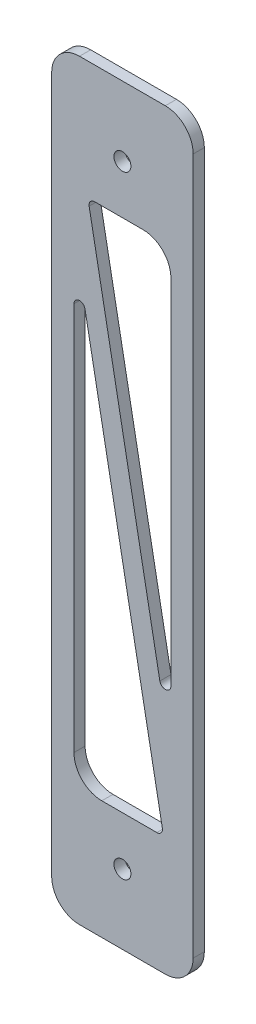
ISO-10303-21;
HEADER;
FILE_DESCRIPTION(('STEP AP214'),'2;1');
FILE_NAME('part.step','',(''),(''),'','','');
FILE_SCHEMA(('AUTOMOTIVE_DESIGN { 1 0 10303 214 1 1 1 1 }'));
ENDSEC;
DATA;
#1=APPLICATION_CONTEXT('core data for automotive mechanical design processes');
#2=APPLICATION_PROTOCOL_DEFINITION('international standard','automotive_design',2000,#1);
#3=PRODUCT_CONTEXT('',#1,'mechanical');
#4=PRODUCT('Part','Part','',(#3));
#5=PRODUCT_RELATED_PRODUCT_CATEGORY('part','',(#4));
#6=PRODUCT_DEFINITION_FORMATION('','',#4);
#7=PRODUCT_DEFINITION_CONTEXT('part definition',#1,'design');
#8=PRODUCT_DEFINITION('design','',#6,#7);
#9=PRODUCT_DEFINITION_SHAPE('','',#8);
#10=(LENGTH_UNIT() NAMED_UNIT(*) SI_UNIT(.MILLI.,.METRE.));
#11=(NAMED_UNIT(*) PLANE_ANGLE_UNIT() SI_UNIT($,.RADIAN.));
#12=(NAMED_UNIT(*) SI_UNIT($,.STERADIAN.) SOLID_ANGLE_UNIT());
#13=UNCERTAINTY_MEASURE_WITH_UNIT(LENGTH_MEASURE(1.E-05),#10,'distance_accuracy_value','');
#14=(GEOMETRIC_REPRESENTATION_CONTEXT(3) GLOBAL_UNCERTAINTY_ASSIGNED_CONTEXT((#13)) GLOBAL_UNIT_ASSIGNED_CONTEXT((#10,
#11,#12)) REPRESENTATION_CONTEXT('',''));
#15=CARTESIAN_POINT('',(0.,0.,0.));
#16=DIRECTION('',(0.,0.,1.));
#17=DIRECTION('',(1.,0.,0.));
#18=AXIS2_PLACEMENT_3D('',#15,#16,#17);
#19=CARTESIAN_POINT('',(15.4,-125.,4.));
#20=DIRECTION('',(0.,0.,1.));
#21=DIRECTION('',(1.,0.,0.));
#22=AXIS2_PLACEMENT_3D('',#19,#20,#21);
#23=PLANE('',#22);
#24=CARTESIAN_POINT('',(0.,110.,4.));
#25=DIRECTION('',(0.,0.,1.));
#26=DIRECTION('',(1.,0.,0.));
#27=AXIS2_PLACEMENT_3D('',#24,#25,#26);
#28=CIRCLE('',#27,3.05);
#29=CARTESIAN_POINT('',(3.04999999999996,110.,4.));
#30=VERTEX_POINT('',#29);
#31=EDGE_CURVE('E278',#30,#30,#28,.T.);
#32=ORIENTED_EDGE('',*,*,#31,.F.);
#33=EDGE_LOOP('',(#32));
#34=FACE_BOUND('',#33,.T.);
#35=CARTESIAN_POINT('',(15.4,-125.,4.));
#36=DIRECTION('',(0.,0.,1.));
#37=DIRECTION('',(1.,0.,0.));
#38=AXIS2_PLACEMENT_3D('',#35,#36,#37);
#39=CIRCLE('',#38,10.);
#40=CARTESIAN_POINT('',(15.3999999999999,-135.,4.));
#41=VERTEX_POINT('',#40);
#42=CARTESIAN_POINT('',(25.4,-125.,4.));
#43=VERTEX_POINT('',#42);
#44=EDGE_CURVE('E284',#41,#43,#39,.T.);
#45=ORIENTED_EDGE('',*,*,#44,.T.);
#46=DIRECTION('',(0.,1.,0.));
#47=VECTOR('',#46,1.);
#48=CARTESIAN_POINT('',(25.4,-125.,4.));
#49=LINE('',#48,#47);
#50=CARTESIAN_POINT('',(25.4,125.,4.));
#51=VERTEX_POINT('',#50);
#52=EDGE_CURVE('E287',#43,#51,#49,.T.);
#53=ORIENTED_EDGE('',*,*,#52,.T.);
#54=CARTESIAN_POINT('',(15.4,125.,4.));
#55=DIRECTION('',(0.,0.,1.));
#56=DIRECTION('',(1.,0.,0.));
#57=AXIS2_PLACEMENT_3D('',#54,#55,#56);
#58=CIRCLE('',#57,10.);
#59=CARTESIAN_POINT('',(15.3999999999999,135.,4.));
#60=VERTEX_POINT('',#59);
#61=EDGE_CURVE('E290',#51,#60,#58,.T.);
#62=ORIENTED_EDGE('',*,*,#61,.T.);
#63=DIRECTION('',(-1.,0.,0.));
#64=VECTOR('',#63,1.);
#65=CARTESIAN_POINT('',(15.3999999999999,135.,4.));
#66=LINE('',#65,#64);
#67=CARTESIAN_POINT('',(-15.3999999999999,135.,4.));
#68=VERTEX_POINT('',#67);
#69=EDGE_CURVE('E292',#60,#68,#66,.T.);
#70=ORIENTED_EDGE('',*,*,#69,.T.);
#71=CARTESIAN_POINT('',(-15.4,125.,4.));
#72=DIRECTION('',(0.,0.,1.));
#73=DIRECTION('',(1.,0.,0.));
#74=AXIS2_PLACEMENT_3D('',#71,#72,#73);
#75=CIRCLE('',#74,10.);
#76=CARTESIAN_POINT('',(-25.4,125.,4.));
#77=VERTEX_POINT('',#76);
#78=EDGE_CURVE('E294',#68,#77,#75,.T.);
#79=ORIENTED_EDGE('',*,*,#78,.T.);
#80=DIRECTION('',(0.,-1.,0.));
#81=VECTOR('',#80,1.);
#82=CARTESIAN_POINT('',(-25.4,-125.,4.));
#83=LINE('',#82,#81);
#84=CARTESIAN_POINT('',(-25.4,-125.,4.));
#85=VERTEX_POINT('',#84);
#86=EDGE_CURVE('E296',#77,#85,#83,.T.);
#87=ORIENTED_EDGE('',*,*,#86,.T.);
#88=CARTESIAN_POINT('',(-15.4,-125.,4.));
#89=DIRECTION('',(0.,0.,1.));
#90=DIRECTION('',(-1.,0.,0.));
#91=AXIS2_PLACEMENT_3D('',#88,#89,#90);
#92=CIRCLE('',#91,10.);
#93=CARTESIAN_POINT('',(-15.3999999999999,-135.,4.));
#94=VERTEX_POINT('',#93);
#95=EDGE_CURVE('E298',#85,#94,#92,.T.);
#96=ORIENTED_EDGE('',*,*,#95,.T.);
#97=DIRECTION('',(1.,0.,0.));
#98=VECTOR('',#97,1.);
#99=CARTESIAN_POINT('',(15.3999999999999,-135.,4.));
#100=LINE('',#99,#98);
#101=EDGE_CURVE('E300',#94,#41,#100,.T.);
#102=ORIENTED_EDGE('',*,*,#101,.T.);
#103=EDGE_LOOP('',(#45,#53,#62,#70,#79,#87,#96,#102));
#104=FACE_BOUND('',#103,.T.);
#105=CARTESIAN_POINT('',(0.,-110.,4.));
#106=DIRECTION('',(0.,0.,1.));
#107=DIRECTION('',(1.,0.,0.));
#108=AXIS2_PLACEMENT_3D('',#105,#106,#107);
#109=CIRCLE('',#108,3.05);
#110=CARTESIAN_POINT('',(3.05000000000003,-110.,4.));
#111=VERTEX_POINT('',#110);
#112=EDGE_CURVE('E272',#111,#111,#109,.T.);
#113=ORIENTED_EDGE('',*,*,#112,.F.);
#114=EDGE_LOOP('',(#113));
#115=FACE_BOUND('',#114,.T.);
#116=DIRECTION('',(1.,0.,0.));
#117=VECTOR('',#116,1.);
#118=CARTESIAN_POINT('',(12.3570173407324,-92.4803149606299,4.));
#119=LINE('',#118,#117);
#120=CARTESIAN_POINT('',(-7.39999999999993,-92.4803149606299,4.));
#121=VERTEX_POINT('',#120);
#122=CARTESIAN_POINT('',(12.3570173407324,-92.4803149606299,4.));
#123=VERTEX_POINT('',#122);
#124=EDGE_CURVE('E229',#121,#123,#119,.T.);
#125=ORIENTED_EDGE('',*,*,#124,.F.);
#126=CARTESIAN_POINT('',(-7.4,-82.4803149606299,4.));
#127=DIRECTION('',(0.,0.,1.));
#128=DIRECTION('',(-1.,0.,0.));
#129=AXIS2_PLACEMENT_3D('',#126,#127,#128);
#130=CIRCLE('',#129,10.);
#131=CARTESIAN_POINT('',(-17.4,-82.4803149606298,4.));
#132=VERTEX_POINT('',#131);
#133=EDGE_CURVE('E227',#132,#121,#130,.T.);
#134=ORIENTED_EDGE('',*,*,#133,.F.);
#135=DIRECTION('',(0.,-1.,0.));
#136=VECTOR('',#135,1.);
#137=CARTESIAN_POINT('',(-17.4,-82.4803149606298,4.));
#138=LINE('',#137,#136);
#139=CARTESIAN_POINT('',(-17.4,57.0471394094039,4.));
#140=VERTEX_POINT('',#139);
#141=EDGE_CURVE('E239',#140,#132,#138,.T.);
#142=ORIENTED_EDGE('',*,*,#141,.F.);
#143=CARTESIAN_POINT('',(-15.4,57.0471394094047,4.));
#144=DIRECTION('',(0.,0.,1.));
#145=DIRECTION('',(-1.,0.,0.));
#146=AXIS2_PLACEMENT_3D('',#143,#144,#145);
#147=CIRCLE('',#146,2.);
#148=CARTESIAN_POINT('',(-13.4344867634496,57.4169470850215,4.));
#149=VERTEX_POINT('',#148);
#150=EDGE_CURVE('E236',#149,#140,#147,.T.);
#151=ORIENTED_EDGE('',*,*,#150,.F.);
#152=DIRECTION('',(-0.184903837808803,0.982756618275133,0.));
#153=VECTOR('',#152,1.);
#154=CARTESIAN_POINT('',(-13.4344867634496,57.4169470850215,4.));
#155=LINE('',#154,#153);
#156=CARTESIAN_POINT('',(14.3225305772827,-90.1105072850123,4.));
#157=VERTEX_POINT('',#156);
#158=EDGE_CURVE('E234',#157,#149,#155,.T.);
#159=ORIENTED_EDGE('',*,*,#158,.F.);
#160=CARTESIAN_POINT('',(12.3570173407325,-90.4803149606299,4.));
#161=DIRECTION('',(0.,0.,1.));
#162=DIRECTION('',(1.,0.,0.));
#163=AXIS2_PLACEMENT_3D('',#160,#161,#162);
#164=CIRCLE('',#163,2.);
#165=EDGE_CURVE('E232',#123,#157,#164,.T.);
#166=ORIENTED_EDGE('',*,*,#165,.F.);
#167=EDGE_LOOP('',(#125,#134,#142,#151,#159,#166));
#168=FACE_BOUND('',#167,.T.);
#169=DIRECTION('',(-1.,0.,0.));
#170=VECTOR('',#169,1.);
#171=CARTESIAN_POINT('',(7.39999999999992,92.4803149606299,4.));
#172=LINE('',#171,#170);
#173=CARTESIAN_POINT('',(7.39999999999992,92.4803149606299,4.));
#174=VERTEX_POINT('',#173);
#175=CARTESIAN_POINT('',(-9.98861183781499,92.4803149606299,4.));
#176=VERTEX_POINT('',#175);
#177=EDGE_CURVE('E184',#174,#176,#172,.T.);
#178=ORIENTED_EDGE('',*,*,#177,.F.);
#179=CARTESIAN_POINT('',(7.4,82.4803149606299,4.));
#180=DIRECTION('',(0.,0.,1.));
#181=DIRECTION('',(1.,0.,0.));
#182=AXIS2_PLACEMENT_3D('',#179,#180,#181);
#183=CIRCLE('',#182,10.);
#184=CARTESIAN_POINT('',(17.4,82.4803149606299,4.));
#185=VERTEX_POINT('',#184);
#186=EDGE_CURVE('E176',#185,#174,#183,.T.);
#187=ORIENTED_EDGE('',*,*,#186,.F.);
#188=DIRECTION('',(0.,1.,0.));
#189=VECTOR('',#188,1.);
#190=CARTESIAN_POINT('',(17.4,-44.4591574057088,4.));
#191=LINE('',#190,#189);
#192=CARTESIAN_POINT('',(17.4,-44.4591574057088,4.));
#193=VERTEX_POINT('',#192);
#194=EDGE_CURVE('E205',#193,#185,#191,.T.);
#195=ORIENTED_EDGE('',*,*,#194,.F.);
#196=CARTESIAN_POINT('',(15.4,-44.4591574057096,4.));
#197=DIRECTION('',(0.,0.,1.));
#198=DIRECTION('',(-1.,0.,0.));
#199=AXIS2_PLACEMENT_3D('',#196,#197,#198);
#200=CIRCLE('',#199,2.);
#201=CARTESIAN_POINT('',(13.4344867634496,-44.8289650813264,4.));
#202=VERTEX_POINT('',#201);
#203=EDGE_CURVE('E203',#202,#193,#200,.T.);
#204=ORIENTED_EDGE('',*,*,#203,.F.);
#205=DIRECTION('',(0.184903837808803,-0.982756618275133,0.));
#206=VECTOR('',#205,1.);
#207=CARTESIAN_POINT('',(-11.9541250743653,90.1105072850123,4.));
#208=LINE('',#207,#206);
#209=CARTESIAN_POINT('',(-11.9541250743653,90.1105072850123,4.));
#210=VERTEX_POINT('',#209);
#211=EDGE_CURVE('E199',#210,#202,#208,.T.);
#212=ORIENTED_EDGE('',*,*,#211,.F.);
#213=CARTESIAN_POINT('',(-9.98861183781501,90.4803149606299,4.));
#214=DIRECTION('',(0.,0.,1.));
#215=DIRECTION('',(1.,0.,0.));
#216=AXIS2_PLACEMENT_3D('',#213,#214,#215);
#217=CIRCLE('',#216,2.);
#218=EDGE_CURVE('E197',#176,#210,#217,.T.);
#219=ORIENTED_EDGE('',*,*,#218,.F.);
#220=EDGE_LOOP('',(#178,#187,#195,#204,#212,#219));
#221=FACE_BOUND('',#220,.T.);
#222=ADVANCED_FACE('F39',(#34,#104,#115,#168,#221),#23,.T.);
#223=CARTESIAN_POINT('',(15.4,-125.,0.));
#224=DIRECTION('',(0.,0.,1.));
#225=DIRECTION('',(1.,0.,0.));
#226=AXIS2_PLACEMENT_3D('',#223,#224,#225);
#227=PLANE('',#226);
#228=CARTESIAN_POINT('',(-7.4,-82.4803149606299,0.));
#229=DIRECTION('',(0.,0.,1.));
#230=DIRECTION('',(-1.,0.,0.));
#231=AXIS2_PLACEMENT_3D('',#228,#229,#230);
#232=CIRCLE('',#231,10.);
#233=CARTESIAN_POINT('',(-17.4,-82.4803149606298,0.));
#234=VERTEX_POINT('',#233);
#235=CARTESIAN_POINT('',(-7.39999999999993,-92.4803149606299,0.));
#236=VERTEX_POINT('',#235);
#237=EDGE_CURVE('E192',#234,#236,#232,.T.);
#238=ORIENTED_EDGE('',*,*,#237,.T.);
#239=DIRECTION('',(1.,0.,0.));
#240=VECTOR('',#239,1.);
#241=CARTESIAN_POINT('',(12.3570173407324,-92.4803149606299,0.));
#242=LINE('',#241,#240);
#243=CARTESIAN_POINT('',(12.3570173407324,-92.4803149606299,0.));
#244=VERTEX_POINT('',#243);
#245=EDGE_CURVE('E244',#236,#244,#242,.T.);
#246=ORIENTED_EDGE('',*,*,#245,.T.);
#247=CARTESIAN_POINT('',(12.3570173407325,-90.4803149606299,0.));
#248=DIRECTION('',(0.,0.,1.));
#249=DIRECTION('',(1.,0.,0.));
#250=AXIS2_PLACEMENT_3D('',#247,#248,#249);
#251=CIRCLE('',#250,2.);
#252=CARTESIAN_POINT('',(14.3225305772827,-90.1105072850123,0.));
#253=VERTEX_POINT('',#252);
#254=EDGE_CURVE('E247',#244,#253,#251,.T.);
#255=ORIENTED_EDGE('',*,*,#254,.T.);
#256=DIRECTION('',(-0.184903837808803,0.982756618275133,0.));
#257=VECTOR('',#256,1.);
#258=CARTESIAN_POINT('',(-13.4344867634496,57.4169470850215,0.));
#259=LINE('',#258,#257);
#260=CARTESIAN_POINT('',(-13.4344867634496,57.4169470850215,0.));
#261=VERTEX_POINT('',#260);
#262=EDGE_CURVE('E250',#253,#261,#259,.T.);
#263=ORIENTED_EDGE('',*,*,#262,.T.);
#264=CARTESIAN_POINT('',(-15.4,57.0471394094047,0.));
#265=DIRECTION('',(0.,0.,1.));
#266=DIRECTION('',(-1.,0.,0.));
#267=AXIS2_PLACEMENT_3D('',#264,#265,#266);
#268=CIRCLE('',#267,2.);
#269=CARTESIAN_POINT('',(-17.4,57.0471394094039,0.));
#270=VERTEX_POINT('',#269);
#271=EDGE_CURVE('E253',#261,#270,#268,.T.);
#272=ORIENTED_EDGE('',*,*,#271,.T.);
#273=DIRECTION('',(0.,-1.,0.));
#274=VECTOR('',#273,1.);
#275=CARTESIAN_POINT('',(-17.4,-82.4803149606298,0.));
#276=LINE('',#275,#274);
#277=EDGE_CURVE('E230',#270,#234,#276,.T.);
#278=ORIENTED_EDGE('',*,*,#277,.T.);
#279=EDGE_LOOP('',(#238,#246,#255,#263,#272,#278));
#280=FACE_BOUND('',#279,.T.);
#281=CARTESIAN_POINT('',(15.4,-125.,0.));
#282=DIRECTION('',(0.,0.,1.));
#283=DIRECTION('',(1.,0.,0.));
#284=AXIS2_PLACEMENT_3D('',#281,#282,#283);
#285=CIRCLE('',#284,10.);
#286=CARTESIAN_POINT('',(15.3999999999999,-135.,0.));
#287=VERTEX_POINT('',#286);
#288=CARTESIAN_POINT('',(25.4,-125.,0.));
#289=VERTEX_POINT('',#288);
#290=EDGE_CURVE('E281',#287,#289,#285,.T.);
#291=ORIENTED_EDGE('',*,*,#290,.F.);
#292=DIRECTION('',(1.,0.,0.));
#293=VECTOR('',#292,1.);
#294=CARTESIAN_POINT('',(15.3999999999999,-135.,0.));
#295=LINE('',#294,#293);
#296=CARTESIAN_POINT('',(-15.3999999999999,-135.,0.));
#297=VERTEX_POINT('',#296);
#298=EDGE_CURVE('E288',#297,#287,#295,.T.);
#299=ORIENTED_EDGE('',*,*,#298,.F.);
#300=CARTESIAN_POINT('',(-15.4,-125.,0.));
#301=DIRECTION('',(0.,0.,1.));
#302=DIRECTION('',(-1.,0.,0.));
#303=AXIS2_PLACEMENT_3D('',#300,#301,#302);
#304=CIRCLE('',#303,10.);
#305=CARTESIAN_POINT('',(-25.4,-125.,0.));
#306=VERTEX_POINT('',#305);
#307=EDGE_CURVE('E315',#306,#297,#304,.T.);
#308=ORIENTED_EDGE('',*,*,#307,.F.);
#309=DIRECTION('',(0.,-1.,0.));
#310=VECTOR('',#309,1.);
#311=CARTESIAN_POINT('',(-25.4,-125.,0.));
#312=LINE('',#311,#310);
#313=CARTESIAN_POINT('',(-25.4,125.,0.));
#314=VERTEX_POINT('',#313);
#315=EDGE_CURVE('E313',#314,#306,#312,.T.);
#316=ORIENTED_EDGE('',*,*,#315,.F.);
#317=CARTESIAN_POINT('',(-15.4,125.,0.));
#318=DIRECTION('',(0.,0.,1.));
#319=DIRECTION('',(1.,0.,0.));
#320=AXIS2_PLACEMENT_3D('',#317,#318,#319);
#321=CIRCLE('',#320,10.);
#322=CARTESIAN_POINT('',(-15.3999999999999,135.,0.));
#323=VERTEX_POINT('',#322);
#324=EDGE_CURVE('E311',#323,#314,#321,.T.);
#325=ORIENTED_EDGE('',*,*,#324,.F.);
#326=DIRECTION('',(-1.,0.,0.));
#327=VECTOR('',#326,1.);
#328=CARTESIAN_POINT('',(15.3999999999999,135.,0.));
#329=LINE('',#328,#327);
#330=CARTESIAN_POINT('',(15.3999999999999,135.,0.));
#331=VERTEX_POINT('',#330);
#332=EDGE_CURVE('E309',#331,#323,#329,.T.);
#333=ORIENTED_EDGE('',*,*,#332,.F.);
#334=CARTESIAN_POINT('',(15.4,125.,0.));
#335=DIRECTION('',(0.,0.,1.));
#336=DIRECTION('',(1.,0.,0.));
#337=AXIS2_PLACEMENT_3D('',#334,#335,#336);
#338=CIRCLE('',#337,10.);
#339=CARTESIAN_POINT('',(25.4,125.,0.));
#340=VERTEX_POINT('',#339);
#341=EDGE_CURVE('E307',#340,#331,#338,.T.);
#342=ORIENTED_EDGE('',*,*,#341,.F.);
#343=DIRECTION('',(0.,1.,0.));
#344=VECTOR('',#343,1.);
#345=CARTESIAN_POINT('',(25.4,-125.,0.));
#346=LINE('',#345,#344);
#347=EDGE_CURVE('E305',#289,#340,#346,.T.);
#348=ORIENTED_EDGE('',*,*,#347,.F.);
#349=EDGE_LOOP('',(#291,#299,#308,#316,#325,#333,#342,#348));
#350=FACE_BOUND('',#349,.T.);
#351=CARTESIAN_POINT('',(0.,110.,0.));
#352=DIRECTION('',(0.,0.,1.));
#353=DIRECTION('',(1.,0.,0.));
#354=AXIS2_PLACEMENT_3D('',#351,#352,#353);
#355=CIRCLE('',#354,3.05);
#356=CARTESIAN_POINT('',(3.04999999999996,110.,0.));
#357=VERTEX_POINT('',#356);
#358=EDGE_CURVE('E275',#357,#357,#355,.T.);
#359=ORIENTED_EDGE('',*,*,#358,.T.);
#360=EDGE_LOOP('',(#359));
#361=FACE_BOUND('',#360,.T.);
#362=CARTESIAN_POINT('',(0.,-110.,0.));
#363=DIRECTION('',(0.,0.,1.));
#364=DIRECTION('',(1.,0.,0.));
#365=AXIS2_PLACEMENT_3D('',#362,#363,#364);
#366=CIRCLE('',#365,3.05);
#367=CARTESIAN_POINT('',(3.05000000000003,-110.,0.));
#368=VERTEX_POINT('',#367);
#369=EDGE_CURVE('E271',#368,#368,#366,.T.);
#370=ORIENTED_EDGE('',*,*,#369,.T.);
#371=EDGE_LOOP('',(#370));
#372=FACE_BOUND('',#371,.T.);
#373=CARTESIAN_POINT('',(7.4,82.4803149606299,0.));
#374=DIRECTION('',(0.,0.,1.));
#375=DIRECTION('',(1.,0.,0.));
#376=AXIS2_PLACEMENT_3D('',#373,#374,#375);
#377=CIRCLE('',#376,10.);
#378=CARTESIAN_POINT('',(17.4,82.4803149606299,0.));
#379=VERTEX_POINT('',#378);
#380=CARTESIAN_POINT('',(7.39999999999992,92.4803149606299,0.));
#381=VERTEX_POINT('',#380);
#382=EDGE_CURVE('E62',#379,#381,#377,.T.);
#383=ORIENTED_EDGE('',*,*,#382,.T.);
#384=DIRECTION('',(-1.,0.,0.));
#385=VECTOR('',#384,1.);
#386=CARTESIAN_POINT('',(7.39999999999992,92.4803149606299,0.));
#387=LINE('',#386,#385);
#388=CARTESIAN_POINT('',(-9.98861183781499,92.4803149606299,0.));
#389=VERTEX_POINT('',#388);
#390=EDGE_CURVE('E191',#381,#389,#387,.T.);
#391=ORIENTED_EDGE('',*,*,#390,.T.);
#392=CARTESIAN_POINT('',(-9.98861183781501,90.4803149606299,0.));
#393=DIRECTION('',(0.,0.,1.));
#394=DIRECTION('',(1.,0.,0.));
#395=AXIS2_PLACEMENT_3D('',#392,#393,#394);
#396=CIRCLE('',#395,2.);
#397=CARTESIAN_POINT('',(-11.9541250743653,90.1105072850123,0.));
#398=VERTEX_POINT('',#397);
#399=EDGE_CURVE('E209',#389,#398,#396,.T.);
#400=ORIENTED_EDGE('',*,*,#399,.T.);
#401=DIRECTION('',(0.184903837808803,-0.982756618275133,0.));
#402=VECTOR('',#401,1.);
#403=CARTESIAN_POINT('',(-11.9541250743653,90.1105072850123,0.));
#404=LINE('',#403,#402);
#405=CARTESIAN_POINT('',(13.4344867634496,-44.8289650813264,0.));
#406=VERTEX_POINT('',#405);
#407=EDGE_CURVE('E212',#398,#406,#404,.T.);
#408=ORIENTED_EDGE('',*,*,#407,.T.);
#409=CARTESIAN_POINT('',(15.4,-44.4591574057096,0.));
#410=DIRECTION('',(0.,0.,1.));
#411=DIRECTION('',(-1.,0.,0.));
#412=AXIS2_PLACEMENT_3D('',#409,#410,#411);
#413=CIRCLE('',#412,2.);
#414=CARTESIAN_POINT('',(17.4,-44.4591574057088,0.));
#415=VERTEX_POINT('',#414);
#416=EDGE_CURVE('E215',#406,#415,#413,.T.);
#417=ORIENTED_EDGE('',*,*,#416,.T.);
#418=DIRECTION('',(0.,1.,0.));
#419=VECTOR('',#418,1.);
#420=CARTESIAN_POINT('',(17.4,-44.4591574057088,0.));
#421=LINE('',#420,#419);
#422=EDGE_CURVE('E185',#415,#379,#421,.T.);
#423=ORIENTED_EDGE('',*,*,#422,.T.);
#424=EDGE_LOOP('',(#383,#391,#400,#408,#417,#423));
#425=FACE_BOUND('',#424,.T.);
#426=ADVANCED_FACE('F345',(#280,#350,#361,#372,#425),#227,.F.);
#427=CARTESIAN_POINT('',(15.4,-125.,4.));
#428=DIRECTION('',(0.,0.,-1.));
#429=DIRECTION('',(-1.,0.,0.));
#430=AXIS2_PLACEMENT_3D('',#427,#428,#429);
#431=CYLINDRICAL_SURFACE('',#430,10.);
#432=ORIENTED_EDGE('',*,*,#290,.T.);
#433=DIRECTION('',(0.,0.,-1.));
#434=VECTOR('',#433,1.);
#435=CARTESIAN_POINT('',(25.4,-125.,4.));
#436=LINE('',#435,#434);
#437=EDGE_CURVE('E11',#43,#289,#436,.T.);
#438=ORIENTED_EDGE('',*,*,#437,.F.);
#439=ORIENTED_EDGE('',*,*,#44,.F.);
#440=DIRECTION('',(0.,0.,-1.));
#441=VECTOR('',#440,1.);
#442=CARTESIAN_POINT('',(15.3999999999999,-135.,4.));
#443=LINE('',#442,#441);
#444=EDGE_CURVE('E302',#41,#287,#443,.T.);
#445=ORIENTED_EDGE('',*,*,#444,.T.);
#446=EDGE_LOOP('',(#432,#438,#439,#445));
#447=FACE_BOUND('',#446,.T.);
#448=ADVANCED_FACE('F41',(#447),#431,.T.);
#449=CARTESIAN_POINT('',(25.4,-125.,4.));
#450=DIRECTION('',(-1.,0.,0.));
#451=DIRECTION('',(0.,0.,1.));
#452=AXIS2_PLACEMENT_3D('',#449,#450,#451);
#453=PLANE('',#452);
#454=ORIENTED_EDGE('',*,*,#347,.T.);
#455=DIRECTION('',(0.,0.,-1.));
#456=VECTOR('',#455,1.);
#457=CARTESIAN_POINT('',(25.4,125.,4.));
#458=LINE('',#457,#456);
#459=EDGE_CURVE('E47',#51,#340,#458,.T.);
#460=ORIENTED_EDGE('',*,*,#459,.F.);
#461=ORIENTED_EDGE('',*,*,#52,.F.);
#462=ORIENTED_EDGE('',*,*,#437,.T.);
#463=EDGE_LOOP('',(#454,#460,#461,#462));
#464=FACE_BOUND('',#463,.T.);
#465=ADVANCED_FACE('F363',(#464),#453,.F.);
#466=CARTESIAN_POINT('',(15.4,125.,4.));
#467=DIRECTION('',(0.,0.,-1.));
#468=DIRECTION('',(-1.,0.,0.));
#469=AXIS2_PLACEMENT_3D('',#466,#467,#468);
#470=CYLINDRICAL_SURFACE('',#469,10.);
#471=ORIENTED_EDGE('',*,*,#341,.T.);
#472=DIRECTION('',(0.,0.,-1.));
#473=VECTOR('',#472,1.);
#474=CARTESIAN_POINT('',(15.3999999999999,135.,4.));
#475=LINE('',#474,#473);
#476=EDGE_CURVE('E332',#60,#331,#475,.T.);
#477=ORIENTED_EDGE('',*,*,#476,.F.);
#478=ORIENTED_EDGE('',*,*,#61,.F.);
#479=ORIENTED_EDGE('',*,*,#459,.T.);
#480=EDGE_LOOP('',(#471,#477,#478,#479));
#481=FACE_BOUND('',#480,.T.);
#482=ADVANCED_FACE('F339',(#481),#470,.T.);
#483=CARTESIAN_POINT('',(15.3999999999999,135.,4.));
#484=DIRECTION('',(0.,-1.,0.));
#485=DIRECTION('',(0.,0.,-1.));
#486=AXIS2_PLACEMENT_3D('',#483,#484,#485);
#487=PLANE('',#486);
#488=ORIENTED_EDGE('',*,*,#332,.T.);
#489=DIRECTION('',(0.,0.,-1.));
#490=VECTOR('',#489,1.);
#491=CARTESIAN_POINT('',(-15.3999999999999,135.,4.));
#492=LINE('',#491,#490);
#493=EDGE_CURVE('E329',#68,#323,#492,.T.);
#494=ORIENTED_EDGE('',*,*,#493,.F.);
#495=ORIENTED_EDGE('',*,*,#69,.F.);
#496=ORIENTED_EDGE('',*,*,#476,.T.);
#497=EDGE_LOOP('',(#488,#494,#495,#496));
#498=FACE_BOUND('',#497,.T.);
#499=ADVANCED_FACE('F351',(#498),#487,.F.);
#500=CARTESIAN_POINT('',(-15.4,125.,4.));
#501=DIRECTION('',(0.,0.,-1.));
#502=DIRECTION('',(-1.,0.,0.));
#503=AXIS2_PLACEMENT_3D('',#500,#501,#502);
#504=CYLINDRICAL_SURFACE('',#503,10.);
#505=ORIENTED_EDGE('',*,*,#324,.T.);
#506=DIRECTION('',(0.,0.,-1.));
#507=VECTOR('',#506,1.);
#508=CARTESIAN_POINT('',(-25.4,125.,4.));
#509=LINE('',#508,#507);
#510=EDGE_CURVE('E326',#77,#314,#509,.T.);
#511=ORIENTED_EDGE('',*,*,#510,.F.);
#512=ORIENTED_EDGE('',*,*,#78,.F.);
#513=ORIENTED_EDGE('',*,*,#493,.T.);
#514=EDGE_LOOP('',(#505,#511,#512,#513));
#515=FACE_BOUND('',#514,.T.);
#516=ADVANCED_FACE('F355',(#515),#504,.T.);
#517=CARTESIAN_POINT('',(-25.4,-125.,4.));
#518=DIRECTION('',(1.,0.,0.));
#519=DIRECTION('',(0.,0.,-1.));
#520=AXIS2_PLACEMENT_3D('',#517,#518,#519);
#521=PLANE('',#520);
#522=ORIENTED_EDGE('',*,*,#315,.T.);
#523=DIRECTION('',(0.,0.,-1.));
#524=VECTOR('',#523,1.);
#525=CARTESIAN_POINT('',(-25.4,-125.,4.));
#526=LINE('',#525,#524);
#527=EDGE_CURVE('E323',#85,#306,#526,.T.);
#528=ORIENTED_EDGE('',*,*,#527,.F.);
#529=ORIENTED_EDGE('',*,*,#86,.F.);
#530=ORIENTED_EDGE('',*,*,#510,.T.);
#531=EDGE_LOOP('',(#522,#528,#529,#530));
#532=FACE_BOUND('',#531,.T.);
#533=ADVANCED_FACE('F376',(#532),#521,.F.);
#534=CARTESIAN_POINT('',(-15.4,-125.,4.));
#535=DIRECTION('',(0.,0.,-1.));
#536=DIRECTION('',(-1.,0.,0.));
#537=AXIS2_PLACEMENT_3D('',#534,#535,#536);
#538=CYLINDRICAL_SURFACE('',#537,10.);
#539=ORIENTED_EDGE('',*,*,#307,.T.);
#540=DIRECTION('',(0.,0.,-1.));
#541=VECTOR('',#540,1.);
#542=CARTESIAN_POINT('',(-15.3999999999999,-135.,4.));
#543=LINE('',#542,#541);
#544=EDGE_CURVE('E320',#94,#297,#543,.T.);
#545=ORIENTED_EDGE('',*,*,#544,.F.);
#546=ORIENTED_EDGE('',*,*,#95,.F.);
#547=ORIENTED_EDGE('',*,*,#527,.T.);
#548=EDGE_LOOP('',(#539,#545,#546,#547));
#549=FACE_BOUND('',#548,.T.);
#550=ADVANCED_FACE('F374',(#549),#538,.T.);
#551=CARTESIAN_POINT('',(15.3999999999999,-135.,4.));
#552=DIRECTION('',(0.,1.,0.));
#553=DIRECTION('',(0.,0.,1.));
#554=AXIS2_PLACEMENT_3D('',#551,#552,#553);
#555=PLANE('',#554);
#556=ORIENTED_EDGE('',*,*,#298,.T.);
#557=ORIENTED_EDGE('',*,*,#444,.F.);
#558=ORIENTED_EDGE('',*,*,#101,.F.);
#559=ORIENTED_EDGE('',*,*,#544,.T.);
#560=EDGE_LOOP('',(#556,#557,#558,#559));
#561=FACE_BOUND('',#560,.T.);
#562=ADVANCED_FACE('F369',(#561),#555,.F.);
#563=CARTESIAN_POINT('',(0.,110.,4.));
#564=DIRECTION('',(0.,0.,-1.));
#565=DIRECTION('',(-1.,0.,0.));
#566=AXIS2_PLACEMENT_3D('',#563,#564,#565);
#567=CYLINDRICAL_SURFACE('',#566,3.05);
#568=ORIENTED_EDGE('',*,*,#31,.T.);
#569=EDGE_LOOP('',(#568));
#570=FACE_BOUND('',#569,.T.);
#571=ORIENTED_EDGE('',*,*,#358,.F.);
#572=EDGE_LOOP('',(#571));
#573=FACE_BOUND('',#572,.T.);
#574=ADVANCED_FACE('F395',(#570,#573),#567,.F.);
#575=CARTESIAN_POINT('',(0.,-110.,4.));
#576=DIRECTION('',(0.,0.,-1.));
#577=DIRECTION('',(-1.,0.,0.));
#578=AXIS2_PLACEMENT_3D('',#575,#576,#577);
#579=CYLINDRICAL_SURFACE('',#578,3.05);
#580=ORIENTED_EDGE('',*,*,#112,.T.);
#581=EDGE_LOOP('',(#580));
#582=FACE_BOUND('',#581,.T.);
#583=ORIENTED_EDGE('',*,*,#369,.F.);
#584=EDGE_LOOP('',(#583));
#585=FACE_BOUND('',#584,.T.);
#586=ADVANCED_FACE('F402',(#582,#585),#579,.F.);
#587=CARTESIAN_POINT('',(-7.4,-82.4803149606299,4.));
#588=DIRECTION('',(0.,0.,-1.));
#589=DIRECTION('',(-1.,0.,0.));
#590=AXIS2_PLACEMENT_3D('',#587,#588,#589);
#591=CYLINDRICAL_SURFACE('',#590,10.);
#592=ORIENTED_EDGE('',*,*,#237,.F.);
#593=DIRECTION('',(0.,0.,-1.));
#594=VECTOR('',#593,1.);
#595=CARTESIAN_POINT('',(-17.4,-82.4803149606298,4.));
#596=LINE('',#595,#594);
#597=EDGE_CURVE('E241',#132,#234,#596,.T.);
#598=ORIENTED_EDGE('',*,*,#597,.F.);
#599=ORIENTED_EDGE('',*,*,#133,.T.);
#600=DIRECTION('',(0.,0.,-1.));
#601=VECTOR('',#600,1.);
#602=CARTESIAN_POINT('',(-7.39999999999993,-92.4803149606299,4.));
#603=LINE('',#602,#601);
#604=EDGE_CURVE('E268',#121,#236,#603,.T.);
#605=ORIENTED_EDGE('',*,*,#604,.T.);
#606=EDGE_LOOP('',(#592,#598,#599,#605));
#607=FACE_BOUND('',#606,.T.);
#608=ADVANCED_FACE('F407',(#607),#591,.F.);
#609=CARTESIAN_POINT('',(12.3570173407324,-92.4803149606299,4.));
#610=DIRECTION('',(0.,1.,0.));
#611=DIRECTION('',(-1.,0.,0.));
#612=AXIS2_PLACEMENT_3D('',#609,#610,#611);
#613=PLANE('',#612);
#614=ORIENTED_EDGE('',*,*,#245,.F.);
#615=ORIENTED_EDGE('',*,*,#604,.F.);
#616=ORIENTED_EDGE('',*,*,#124,.T.);
#617=DIRECTION('',(0.,0.,-1.));
#618=VECTOR('',#617,1.);
#619=CARTESIAN_POINT('',(12.3570173407324,-92.4803149606299,4.));
#620=LINE('',#619,#618);
#621=EDGE_CURVE('E266',#123,#244,#620,.T.);
#622=ORIENTED_EDGE('',*,*,#621,.T.);
#623=EDGE_LOOP('',(#614,#615,#616,#622));
#624=FACE_BOUND('',#623,.T.);
#625=ADVANCED_FACE('F454',(#624),#613,.T.);
#626=CARTESIAN_POINT('',(12.3570173407325,-90.4803149606299,4.));
#627=DIRECTION('',(0.,0.,-1.));
#628=DIRECTION('',(-1.,0.,0.));
#629=AXIS2_PLACEMENT_3D('',#626,#627,#628);
#630=CYLINDRICAL_SURFACE('',#629,2.);
#631=ORIENTED_EDGE('',*,*,#254,.F.);
#632=ORIENTED_EDGE('',*,*,#621,.F.);
#633=ORIENTED_EDGE('',*,*,#165,.T.);
#634=DIRECTION('',(0.,0.,-1.));
#635=VECTOR('',#634,1.);
#636=CARTESIAN_POINT('',(14.3225305772827,-90.1105072850123,4.));
#637=LINE('',#636,#635);
#638=EDGE_CURVE('E264',#157,#253,#637,.T.);
#639=ORIENTED_EDGE('',*,*,#638,.T.);
#640=EDGE_LOOP('',(#631,#632,#633,#639));
#641=FACE_BOUND('',#640,.T.);
#642=ADVANCED_FACE('F450',(#641),#630,.F.);
#643=CARTESIAN_POINT('',(-13.4344867634496,57.4169470850215,4.));
#644=DIRECTION('',(-0.982756618275133,-0.184903837808803,0.));
#645=DIRECTION('',(0.184903837808803,-0.982756618275133,0.));
#646=AXIS2_PLACEMENT_3D('',#643,#644,#645);
#647=PLANE('',#646);
#648=ORIENTED_EDGE('',*,*,#262,.F.);
#649=ORIENTED_EDGE('',*,*,#638,.F.);
#650=ORIENTED_EDGE('',*,*,#158,.T.);
#651=DIRECTION('',(0.,0.,-1.));
#652=VECTOR('',#651,1.);
#653=CARTESIAN_POINT('',(-13.4344867634496,57.4169470850215,4.));
#654=LINE('',#653,#652);
#655=EDGE_CURVE('E262',#149,#261,#654,.T.);
#656=ORIENTED_EDGE('',*,*,#655,.T.);
#657=EDGE_LOOP('',(#648,#649,#650,#656));
#658=FACE_BOUND('',#657,.T.);
#659=ADVANCED_FACE('F446',(#658),#647,.T.);
#660=CARTESIAN_POINT('',(-15.4,57.0471394094047,4.));
#661=DIRECTION('',(0.,0.,-1.));
#662=DIRECTION('',(-1.,0.,0.));
#663=AXIS2_PLACEMENT_3D('',#660,#661,#662);
#664=CYLINDRICAL_SURFACE('',#663,2.);
#665=ORIENTED_EDGE('',*,*,#271,.F.);
#666=ORIENTED_EDGE('',*,*,#655,.F.);
#667=ORIENTED_EDGE('',*,*,#150,.T.);
#668=DIRECTION('',(0.,0.,-1.));
#669=VECTOR('',#668,1.);
#670=CARTESIAN_POINT('',(-17.4,57.0471394094039,4.));
#671=LINE('',#670,#669);
#672=EDGE_CURVE('E260',#140,#270,#671,.T.);
#673=ORIENTED_EDGE('',*,*,#672,.T.);
#674=EDGE_LOOP('',(#665,#666,#667,#673));
#675=FACE_BOUND('',#674,.T.);
#676=ADVANCED_FACE('F442',(#675),#664,.F.);
#677=CARTESIAN_POINT('',(-17.4,-82.4803149606298,4.));
#678=DIRECTION('',(1.,0.,0.));
#679=DIRECTION('',(0.,0.,-1.));
#680=AXIS2_PLACEMENT_3D('',#677,#678,#679);
#681=PLANE('',#680);
#682=ORIENTED_EDGE('',*,*,#277,.F.);
#683=ORIENTED_EDGE('',*,*,#672,.F.);
#684=ORIENTED_EDGE('',*,*,#141,.T.);
#685=ORIENTED_EDGE('',*,*,#597,.T.);
#686=EDGE_LOOP('',(#682,#683,#684,#685));
#687=FACE_BOUND('',#686,.T.);
#688=ADVANCED_FACE('F439',(#687),#681,.T.);
#689=CARTESIAN_POINT('',(7.4,82.4803149606299,4.));
#690=DIRECTION('',(0.,0.,-1.));
#691=DIRECTION('',(-1.,0.,0.));
#692=AXIS2_PLACEMENT_3D('',#689,#690,#691);
#693=CYLINDRICAL_SURFACE('',#692,10.);
#694=ORIENTED_EDGE('',*,*,#382,.F.);
#695=DIRECTION('',(0.,0.,-1.));
#696=VECTOR('',#695,1.);
#697=CARTESIAN_POINT('',(17.4,82.4803149606299,4.));
#698=LINE('',#697,#696);
#699=EDGE_CURVE('E180',#185,#379,#698,.T.);
#700=ORIENTED_EDGE('',*,*,#699,.F.);
#701=ORIENTED_EDGE('',*,*,#186,.T.);
#702=DIRECTION('',(0.,0.,-1.));
#703=VECTOR('',#702,1.);
#704=CARTESIAN_POINT('',(7.39999999999992,92.4803149606299,4.));
#705=LINE('',#704,#703);
#706=EDGE_CURVE('E179',#174,#381,#705,.T.);
#707=ORIENTED_EDGE('',*,*,#706,.T.);
#708=EDGE_LOOP('',(#694,#700,#701,#707));
#709=FACE_BOUND('',#708,.T.);
#710=ADVANCED_FACE('F178',(#709),#693,.F.);
#711=CARTESIAN_POINT('',(7.39999999999992,92.4803149606299,4.));
#712=DIRECTION('',(0.,-1.,0.));
#713=DIRECTION('',(0.,0.,-1.));
#714=AXIS2_PLACEMENT_3D('',#711,#712,#713);
#715=PLANE('',#714);
#716=ORIENTED_EDGE('',*,*,#390,.F.);
#717=ORIENTED_EDGE('',*,*,#706,.F.);
#718=ORIENTED_EDGE('',*,*,#177,.T.);
#719=DIRECTION('',(0.,0.,-1.));
#720=VECTOR('',#719,1.);
#721=CARTESIAN_POINT('',(-9.98861183781499,92.4803149606299,4.));
#722=LINE('',#721,#720);
#723=EDGE_CURVE('E193',#176,#389,#722,.T.);
#724=ORIENTED_EDGE('',*,*,#723,.T.);
#725=EDGE_LOOP('',(#716,#717,#718,#724));
#726=FACE_BOUND('',#725,.T.);
#727=ADVANCED_FACE('F188',(#726),#715,.T.);
#728=CARTESIAN_POINT('',(-9.98861183781501,90.4803149606299,4.));
#729=DIRECTION('',(0.,0.,-1.));
#730=DIRECTION('',(-1.,0.,0.));
#731=AXIS2_PLACEMENT_3D('',#728,#729,#730);
#732=CYLINDRICAL_SURFACE('',#731,2.);
#733=ORIENTED_EDGE('',*,*,#399,.F.);
#734=ORIENTED_EDGE('',*,*,#723,.F.);
#735=ORIENTED_EDGE('',*,*,#218,.T.);
#736=DIRECTION('',(0.,0.,-1.));
#737=VECTOR('',#736,1.);
#738=CARTESIAN_POINT('',(-11.9541250743653,90.1105072850123,4.));
#739=LINE('',#738,#737);
#740=EDGE_CURVE('E224',#210,#398,#739,.T.);
#741=ORIENTED_EDGE('',*,*,#740,.T.);
#742=EDGE_LOOP('',(#733,#734,#735,#741));
#743=FACE_BOUND('',#742,.T.);
#744=ADVANCED_FACE('F426',(#743),#732,.F.);
#745=CARTESIAN_POINT('',(-11.9541250743653,90.1105072850123,4.));
#746=DIRECTION('',(0.982756618275133,0.184903837808803,0.));
#747=DIRECTION('',(-0.184903837808803,0.982756618275133,0.));
#748=AXIS2_PLACEMENT_3D('',#745,#746,#747);
#749=PLANE('',#748);
#750=ORIENTED_EDGE('',*,*,#407,.F.);
#751=ORIENTED_EDGE('',*,*,#740,.F.);
#752=ORIENTED_EDGE('',*,*,#211,.T.);
#753=DIRECTION('',(0.,0.,-1.));
#754=VECTOR('',#753,1.);
#755=CARTESIAN_POINT('',(13.4344867634496,-44.8289650813264,4.));
#756=LINE('',#755,#754);
#757=EDGE_CURVE('E222',#202,#406,#756,.T.);
#758=ORIENTED_EDGE('',*,*,#757,.T.);
#759=EDGE_LOOP('',(#750,#751,#752,#758));
#760=FACE_BOUND('',#759,.T.);
#761=ADVANCED_FACE('F422',(#760),#749,.T.);
#762=CARTESIAN_POINT('',(15.4,-44.4591574057096,4.));
#763=DIRECTION('',(0.,0.,-1.));
#764=DIRECTION('',(-1.,0.,0.));
#765=AXIS2_PLACEMENT_3D('',#762,#763,#764);
#766=CYLINDRICAL_SURFACE('',#765,2.);
#767=ORIENTED_EDGE('',*,*,#416,.F.);
#768=ORIENTED_EDGE('',*,*,#757,.F.);
#769=ORIENTED_EDGE('',*,*,#203,.T.);
#770=DIRECTION('',(0.,0.,-1.));
#771=VECTOR('',#770,1.);
#772=CARTESIAN_POINT('',(17.4,-44.4591574057088,4.));
#773=LINE('',#772,#771);
#774=EDGE_CURVE('E54',#193,#415,#773,.T.);
#775=ORIENTED_EDGE('',*,*,#774,.T.);
#776=EDGE_LOOP('',(#767,#768,#769,#775));
#777=FACE_BOUND('',#776,.T.);
#778=ADVANCED_FACE('F419',(#777),#766,.F.);
#779=CARTESIAN_POINT('',(17.4,-44.4591574057088,4.));
#780=DIRECTION('',(-1.,0.,0.));
#781=DIRECTION('',(0.,0.,1.));
#782=AXIS2_PLACEMENT_3D('',#779,#780,#781);
#783=PLANE('',#782);
#784=ORIENTED_EDGE('',*,*,#422,.F.);
#785=ORIENTED_EDGE('',*,*,#774,.F.);
#786=ORIENTED_EDGE('',*,*,#194,.T.);
#787=ORIENTED_EDGE('',*,*,#699,.T.);
#788=EDGE_LOOP('',(#784,#785,#786,#787));
#789=FACE_BOUND('',#788,.T.);
#790=ADVANCED_FACE('F415',(#789),#783,.T.);
#791=CLOSED_SHELL('',(#222,#426,#448,#465,#482,#499,#516,#533,#550,#562,#574,#586,#608,#625,
#642,#659,#676,#688,#710,#727,#744,#761,#778,#790));
#792=MANIFOLD_SOLID_BREP('B2',#791);
#793=ADVANCED_BREP_SHAPE_REPRESENTATION('',(#18,#792),#14);
#794=SHAPE_DEFINITION_REPRESENTATION(#9,#793);
ENDSEC;
END-ISO-10303-21;
